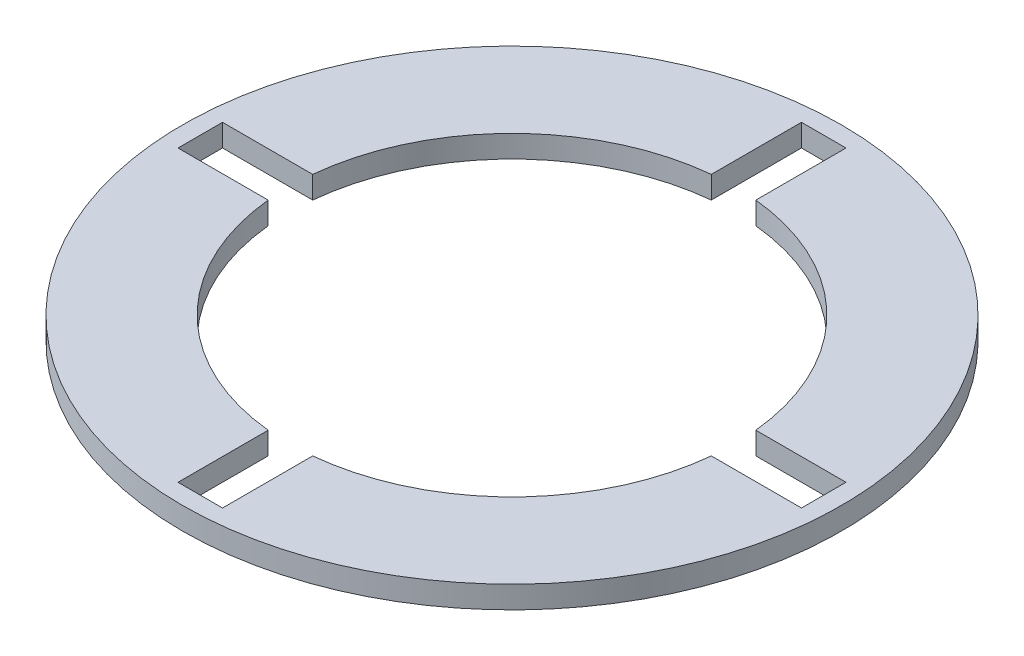
ISO-10303-21;
HEADER;
FILE_DESCRIPTION(('STEP AP214'),'2;1');
FILE_NAME('part.step','',(''),(''),'','','');
FILE_SCHEMA(('AUTOMOTIVE_DESIGN { 1 0 10303 214 1 1 1 1 }'));
ENDSEC;
DATA;
#1=APPLICATION_CONTEXT('core data for automotive mechanical design processes');
#2=APPLICATION_PROTOCOL_DEFINITION('international standard','automotive_design',2000,#1);
#3=PRODUCT_CONTEXT('',#1,'mechanical');
#4=PRODUCT('Part','Part','',(#3));
#5=PRODUCT_RELATED_PRODUCT_CATEGORY('part','',(#4));
#6=PRODUCT_DEFINITION_FORMATION('','',#4);
#7=PRODUCT_DEFINITION_CONTEXT('part definition',#1,'design');
#8=PRODUCT_DEFINITION('design','',#6,#7);
#9=PRODUCT_DEFINITION_SHAPE('','',#8);
#10=(LENGTH_UNIT() NAMED_UNIT(*) SI_UNIT(.MILLI.,.METRE.));
#11=(NAMED_UNIT(*) PLANE_ANGLE_UNIT() SI_UNIT($,.RADIAN.));
#12=(NAMED_UNIT(*) SI_UNIT($,.STERADIAN.) SOLID_ANGLE_UNIT());
#13=UNCERTAINTY_MEASURE_WITH_UNIT(LENGTH_MEASURE(1.E-05),#10,'distance_accuracy_value','');
#14=(GEOMETRIC_REPRESENTATION_CONTEXT(3) GLOBAL_UNCERTAINTY_ASSIGNED_CONTEXT((#13)) GLOBAL_UNIT_ASSIGNED_CONTEXT((#10,
#11,#12)) REPRESENTATION_CONTEXT('',''));
#15=CARTESIAN_POINT('',(0.,0.,0.));
#16=DIRECTION('',(0.,0.,1.));
#17=DIRECTION('',(1.,0.,0.));
#18=AXIS2_PLACEMENT_3D('',#15,#16,#17);
#19=CARTESIAN_POINT('',(0.,3.175,0.));
#20=DIRECTION('',(0.,1.,0.));
#21=DIRECTION('',(0.,0.,1.));
#22=AXIS2_PLACEMENT_3D('',#19,#20,#21);
#23=PLANE('',#22);
#24=CARTESIAN_POINT('',(0.,3.175,0.));
#25=DIRECTION('',(0.,1.,0.));
#26=DIRECTION('',(0.,0.,1.));
#27=AXIS2_PLACEMENT_3D('',#24,#25,#26);
#28=CIRCLE('',#27,31.75);
#29=CARTESIAN_POINT('',(3.175,3.175,31.5908511281352));
#30=VERTEX_POINT('',#29);
#31=CARTESIAN_POINT('',(31.5908511281352,3.175,3.175));
#32=VERTEX_POINT('',#31);
#33=EDGE_CURVE('E147',#30,#32,#28,.T.);
#34=ORIENTED_EDGE('',*,*,#33,.F.);
#35=DIRECTION('',(0.,0.,1.));
#36=VECTOR('',#35,1.);
#37=CARTESIAN_POINT('',(3.175,3.175,0.));
#38=LINE('',#37,#36);
#39=CARTESIAN_POINT('',(3.175,3.175,44.45));
#40=VERTEX_POINT('',#39);
#41=EDGE_CURVE('E160',#30,#40,#38,.T.);
#42=ORIENTED_EDGE('',*,*,#41,.T.);
#43=DIRECTION('',(-1.,0.,0.));
#44=VECTOR('',#43,1.);
#45=CARTESIAN_POINT('',(0.,3.175,44.45));
#46=LINE('',#45,#44);
#47=CARTESIAN_POINT('',(-3.17499999999999,3.175,44.45));
#48=VERTEX_POINT('',#47);
#49=EDGE_CURVE('E173',#40,#48,#46,.T.);
#50=ORIENTED_EDGE('',*,*,#49,.T.);
#51=DIRECTION('',(0.,0.,1.));
#52=VECTOR('',#51,1.);
#53=CARTESIAN_POINT('',(-3.175,3.175,0.));
#54=LINE('',#53,#52);
#55=CARTESIAN_POINT('',(-3.175,3.175,31.5908511281352));
#56=VERTEX_POINT('',#55);
#57=EDGE_CURVE('E177',#56,#48,#54,.T.);
#58=ORIENTED_EDGE('',*,*,#57,.F.);
#59=CARTESIAN_POINT('',(-31.5908511281352,3.175,3.175));
#60=VERTEX_POINT('',#59);
#61=EDGE_CURVE('E167',#60,#56,#28,.T.);
#62=ORIENTED_EDGE('',*,*,#61,.F.);
#63=DIRECTION('',(1.,0.,0.));
#64=VECTOR('',#63,1.);
#65=CARTESIAN_POINT('',(0.,3.175,3.175));
#66=LINE('',#65,#64);
#67=CARTESIAN_POINT('',(-44.45,3.175,3.175));
#68=VERTEX_POINT('',#67);
#69=EDGE_CURVE('E247',#68,#60,#66,.T.);
#70=ORIENTED_EDGE('',*,*,#69,.F.);
#71=DIRECTION('',(0.,0.,1.));
#72=VECTOR('',#71,1.);
#73=CARTESIAN_POINT('',(-44.45,3.175,0.));
#74=LINE('',#73,#72);
#75=CARTESIAN_POINT('',(-44.45,3.175,-3.175));
#76=VERTEX_POINT('',#75);
#77=EDGE_CURVE('E244',#76,#68,#74,.T.);
#78=ORIENTED_EDGE('',*,*,#77,.F.);
#79=DIRECTION('',(1.,0.,0.));
#80=VECTOR('',#79,1.);
#81=CARTESIAN_POINT('',(0.,3.175,-3.175));
#82=LINE('',#81,#80);
#83=CARTESIAN_POINT('',(-31.5908511281352,3.175,-3.175));
#84=VERTEX_POINT('',#83);
#85=EDGE_CURVE('E250',#76,#84,#82,.T.);
#86=ORIENTED_EDGE('',*,*,#85,.T.);
#87=CARTESIAN_POINT('',(-3.17500000000001,3.175,-31.5908511281352));
#88=VERTEX_POINT('',#87);
#89=EDGE_CURVE('E48',#88,#84,#28,.T.);
#90=ORIENTED_EDGE('',*,*,#89,.F.);
#91=DIRECTION('',(0.,0.,1.));
#92=VECTOR('',#91,1.);
#93=CARTESIAN_POINT('',(-3.175,3.175,0.));
#94=LINE('',#93,#92);
#95=CARTESIAN_POINT('',(-3.17500000000001,3.175,-44.45));
#96=VERTEX_POINT('',#95);
#97=EDGE_CURVE('E189',#96,#88,#94,.T.);
#98=ORIENTED_EDGE('',*,*,#97,.F.);
#99=DIRECTION('',(-1.,0.,0.));
#100=VECTOR('',#99,1.);
#101=CARTESIAN_POINT('',(0.,3.175,-44.45));
#102=LINE('',#101,#100);
#103=CARTESIAN_POINT('',(3.17499999999999,3.175,-44.45));
#104=VERTEX_POINT('',#103);
#105=EDGE_CURVE('E186',#104,#96,#102,.T.);
#106=ORIENTED_EDGE('',*,*,#105,.F.);
#107=DIRECTION('',(0.,0.,1.));
#108=VECTOR('',#107,1.);
#109=CARTESIAN_POINT('',(3.175,3.175,0.));
#110=LINE('',#109,#108);
#111=CARTESIAN_POINT('',(3.17499999999999,3.175,-31.5908511281352));
#112=VERTEX_POINT('',#111);
#113=EDGE_CURVE('E192',#104,#112,#110,.T.);
#114=ORIENTED_EDGE('',*,*,#113,.T.);
#115=CARTESIAN_POINT('',(31.5908511281352,3.175,-3.175));
#116=VERTEX_POINT('',#115);
#117=EDGE_CURVE('E165',#116,#112,#28,.T.);
#118=ORIENTED_EDGE('',*,*,#117,.F.);
#119=DIRECTION('',(1.,0.,0.));
#120=VECTOR('',#119,1.);
#121=CARTESIAN_POINT('',(0.,3.175,-3.175));
#122=LINE('',#121,#120);
#123=CARTESIAN_POINT('',(44.45,3.175,-3.175));
#124=VERTEX_POINT('',#123);
#125=EDGE_CURVE('E295',#116,#124,#122,.T.);
#126=ORIENTED_EDGE('',*,*,#125,.T.);
#127=DIRECTION('',(0.,0.,1.));
#128=VECTOR('',#127,1.);
#129=CARTESIAN_POINT('',(44.45,3.175,0.));
#130=LINE('',#129,#128);
#131=CARTESIAN_POINT('',(44.45,3.175,3.175));
#132=VERTEX_POINT('',#131);
#133=EDGE_CURVE('E285',#124,#132,#130,.T.);
#134=ORIENTED_EDGE('',*,*,#133,.T.);
#135=DIRECTION('',(1.,0.,0.));
#136=VECTOR('',#135,1.);
#137=CARTESIAN_POINT('',(0.,3.175,3.175));
#138=LINE('',#137,#136);
#139=EDGE_CURVE('E163',#32,#132,#138,.T.);
#140=ORIENTED_EDGE('',*,*,#139,.F.);
#141=EDGE_LOOP('',(#34,#42,#50,#58,#62,#70,#78,#86,#90,#98,#106,#114,#118,#126,#134,#140));
#142=FACE_BOUND('',#141,.T.);
#143=CARTESIAN_POINT('',(0.,3.175,0.));
#144=DIRECTION('',(0.,1.,0.));
#145=DIRECTION('',(0.,0.,1.));
#146=AXIS2_PLACEMENT_3D('',#143,#144,#145);
#147=CIRCLE('',#146,46.99);
#148=CARTESIAN_POINT('',(0.,3.175,46.99));
#149=VERTEX_POINT('',#148);
#150=EDGE_CURVE('E206',#149,#149,#147,.T.);
#151=ORIENTED_EDGE('',*,*,#150,.T.);
#152=EDGE_LOOP('',(#151));
#153=FACE_BOUND('',#152,.T.);
#154=ADVANCED_FACE('F33',(#142,#153),#23,.T.);
#155=CARTESIAN_POINT('',(0.,0.,0.));
#156=DIRECTION('',(0.,1.,0.));
#157=DIRECTION('',(0.,0.,1.));
#158=AXIS2_PLACEMENT_3D('',#155,#156,#157);
#159=PLANE('',#158);
#160=CARTESIAN_POINT('',(0.,0.,0.));
#161=DIRECTION('',(0.,1.,0.));
#162=DIRECTION('',(0.,0.,1.));
#163=AXIS2_PLACEMENT_3D('',#160,#161,#162);
#164=CIRCLE('',#163,46.99);
#165=CARTESIAN_POINT('',(0.,0.,46.99));
#166=VERTEX_POINT('',#165);
#167=EDGE_CURVE('E205',#166,#166,#164,.T.);
#168=ORIENTED_EDGE('',*,*,#167,.F.);
#169=EDGE_LOOP('',(#168));
#170=FACE_BOUND('',#169,.T.);
#171=DIRECTION('',(0.,0.,1.));
#172=VECTOR('',#171,1.);
#173=CARTESIAN_POINT('',(3.175,0.,0.));
#174=LINE('',#173,#172);
#175=CARTESIAN_POINT('',(3.175,0.,31.5908511281352));
#176=VERTEX_POINT('',#175);
#177=CARTESIAN_POINT('',(3.175,0.,44.45));
#178=VERTEX_POINT('',#177);
#179=EDGE_CURVE('E184',#176,#178,#174,.T.);
#180=ORIENTED_EDGE('',*,*,#179,.F.);
#181=CARTESIAN_POINT('',(0.,0.,0.));
#182=DIRECTION('',(0.,1.,0.));
#183=DIRECTION('',(0.,0.,1.));
#184=AXIS2_PLACEMENT_3D('',#181,#182,#183);
#185=CIRCLE('',#184,31.75);
#186=CARTESIAN_POINT('',(31.5908511281352,0.,3.175));
#187=VERTEX_POINT('',#186);
#188=EDGE_CURVE('E150',#176,#187,#185,.T.);
#189=ORIENTED_EDGE('',*,*,#188,.T.);
#190=DIRECTION('',(1.,0.,0.));
#191=VECTOR('',#190,1.);
#192=CARTESIAN_POINT('',(0.,0.,3.175));
#193=LINE('',#192,#191);
#194=CARTESIAN_POINT('',(44.45,0.,3.175));
#195=VERTEX_POINT('',#194);
#196=EDGE_CURVE('E235',#187,#195,#193,.T.);
#197=ORIENTED_EDGE('',*,*,#196,.T.);
#198=DIRECTION('',(0.,0.,1.));
#199=VECTOR('',#198,1.);
#200=CARTESIAN_POINT('',(44.45,0.,0.));
#201=LINE('',#200,#199);
#202=CARTESIAN_POINT('',(44.45,0.,-3.175));
#203=VERTEX_POINT('',#202);
#204=EDGE_CURVE('E41',#203,#195,#201,.T.);
#205=ORIENTED_EDGE('',*,*,#204,.F.);
#206=DIRECTION('',(1.,0.,0.));
#207=VECTOR('',#206,1.);
#208=CARTESIAN_POINT('',(0.,0.,-3.175));
#209=LINE('',#208,#207);
#210=CARTESIAN_POINT('',(31.5908511281352,0.,-3.175));
#211=VERTEX_POINT('',#210);
#212=EDGE_CURVE('E236',#211,#203,#209,.T.);
#213=ORIENTED_EDGE('',*,*,#212,.F.);
#214=CARTESIAN_POINT('',(3.17499999999999,0.,-31.5908511281352));
#215=VERTEX_POINT('',#214);
#216=EDGE_CURVE('E164',#211,#215,#185,.T.);
#217=ORIENTED_EDGE('',*,*,#216,.T.);
#218=DIRECTION('',(0.,0.,1.));
#219=VECTOR('',#218,1.);
#220=CARTESIAN_POINT('',(3.175,0.,0.));
#221=LINE('',#220,#219);
#222=CARTESIAN_POINT('',(3.17499999999999,0.,-44.45));
#223=VERTEX_POINT('',#222);
#224=EDGE_CURVE('E202',#223,#215,#221,.T.);
#225=ORIENTED_EDGE('',*,*,#224,.F.);
#226=DIRECTION('',(-1.,0.,0.));
#227=VECTOR('',#226,1.);
#228=CARTESIAN_POINT('',(0.,0.,-44.45));
#229=LINE('',#228,#227);
#230=CARTESIAN_POINT('',(-3.17500000000001,0.,-44.45));
#231=VERTEX_POINT('',#230);
#232=EDGE_CURVE('E209',#223,#231,#229,.T.);
#233=ORIENTED_EDGE('',*,*,#232,.T.);
#234=DIRECTION('',(0.,0.,1.));
#235=VECTOR('',#234,1.);
#236=CARTESIAN_POINT('',(-3.175,0.,0.));
#237=LINE('',#236,#235);
#238=CARTESIAN_POINT('',(-3.17500000000001,0.,-31.5908511281352));
#239=VERTEX_POINT('',#238);
#240=EDGE_CURVE('E198',#231,#239,#237,.T.);
#241=ORIENTED_EDGE('',*,*,#240,.T.);
#242=CARTESIAN_POINT('',(-31.5908511281352,0.,-3.175));
#243=VERTEX_POINT('',#242);
#244=EDGE_CURVE('E275',#239,#243,#185,.T.);
#245=ORIENTED_EDGE('',*,*,#244,.T.);
#246=DIRECTION('',(1.,0.,0.));
#247=VECTOR('',#246,1.);
#248=CARTESIAN_POINT('',(0.,0.,-3.175));
#249=LINE('',#248,#247);
#250=CARTESIAN_POINT('',(-44.45,0.,-3.175));
#251=VERTEX_POINT('',#250);
#252=EDGE_CURVE('E260',#251,#243,#249,.T.);
#253=ORIENTED_EDGE('',*,*,#252,.F.);
#254=DIRECTION('',(0.,0.,1.));
#255=VECTOR('',#254,1.);
#256=CARTESIAN_POINT('',(-44.45,0.,0.));
#257=LINE('',#256,#255);
#258=CARTESIAN_POINT('',(-44.45,0.,3.175));
#259=VERTEX_POINT('',#258);
#260=EDGE_CURVE('E217',#251,#259,#257,.T.);
#261=ORIENTED_EDGE('',*,*,#260,.T.);
#262=DIRECTION('',(1.,0.,0.));
#263=VECTOR('',#262,1.);
#264=CARTESIAN_POINT('',(0.,0.,3.175));
#265=LINE('',#264,#263);
#266=CARTESIAN_POINT('',(-31.5908511281352,0.,3.175));
#267=VERTEX_POINT('',#266);
#268=EDGE_CURVE('E256',#259,#267,#265,.T.);
#269=ORIENTED_EDGE('',*,*,#268,.T.);
#270=CARTESIAN_POINT('',(-3.175,0.,31.5908511281352));
#271=VERTEX_POINT('',#270);
#272=EDGE_CURVE('E56',#267,#271,#185,.T.);
#273=ORIENTED_EDGE('',*,*,#272,.T.);
#274=DIRECTION('',(0.,0.,1.));
#275=VECTOR('',#274,1.);
#276=CARTESIAN_POINT('',(-3.175,0.,0.));
#277=LINE('',#276,#275);
#278=CARTESIAN_POINT('',(-3.17499999999999,0.,44.45));
#279=VERTEX_POINT('',#278);
#280=EDGE_CURVE('E181',#271,#279,#277,.T.);
#281=ORIENTED_EDGE('',*,*,#280,.T.);
#282=DIRECTION('',(-1.,0.,0.));
#283=VECTOR('',#282,1.);
#284=CARTESIAN_POINT('',(0.,0.,44.45));
#285=LINE('',#284,#283);
#286=EDGE_CURVE('E214',#178,#279,#285,.T.);
#287=ORIENTED_EDGE('',*,*,#286,.F.);
#288=EDGE_LOOP('',(#180,#189,#197,#205,#213,#217,#225,#233,#241,#245,#253,#261,#269,#273,#281,#287));
#289=FACE_BOUND('',#288,.T.);
#290=ADVANCED_FACE('F273',(#170,#289),#159,.F.);
#291=CARTESIAN_POINT('',(0.,3.175,0.));
#292=DIRECTION('',(0.,-1.,0.));
#293=DIRECTION('',(0.,0.,-1.));
#294=AXIS2_PLACEMENT_3D('',#291,#292,#293);
#295=CYLINDRICAL_SURFACE('',#294,46.99);
#296=ORIENTED_EDGE('',*,*,#150,.F.);
#297=EDGE_LOOP('',(#296));
#298=FACE_BOUND('',#297,.T.);
#299=ORIENTED_EDGE('',*,*,#167,.T.);
#300=EDGE_LOOP('',(#299));
#301=FACE_BOUND('',#300,.T.);
#302=ADVANCED_FACE('F35',(#298,#301),#295,.T.);
#303=CARTESIAN_POINT('',(0.,-4.445,-44.45));
#304=DIRECTION('',(0.,0.,-1.));
#305=DIRECTION('',(-1.,0.,0.));
#306=AXIS2_PLACEMENT_3D('',#303,#304,#305);
#307=PLANE('',#306);
#308=DIRECTION('',(0.,1.,0.));
#309=VECTOR('',#308,1.);
#310=CARTESIAN_POINT('',(3.17499999999999,-4.445,-44.45));
#311=LINE('',#310,#309);
#312=EDGE_CURVE('E196',#223,#104,#311,.T.);
#313=ORIENTED_EDGE('',*,*,#312,.T.);
#314=ORIENTED_EDGE('',*,*,#105,.T.);
#315=DIRECTION('',(0.,1.,0.));
#316=VECTOR('',#315,1.);
#317=CARTESIAN_POINT('',(-3.17500000000001,-4.445,-44.45));
#318=LINE('',#317,#316);
#319=EDGE_CURVE('E195',#231,#96,#318,.T.);
#320=ORIENTED_EDGE('',*,*,#319,.F.);
#321=ORIENTED_EDGE('',*,*,#232,.F.);
#322=EDGE_LOOP('',(#313,#314,#320,#321));
#323=FACE_BOUND('',#322,.T.);
#324=ADVANCED_FACE('F310',(#323),#307,.F.);
#325=CARTESIAN_POINT('',(3.175,-4.445,0.));
#326=DIRECTION('',(-1.,0.,0.));
#327=DIRECTION('',(0.,0.,1.));
#328=AXIS2_PLACEMENT_3D('',#325,#326,#327);
#329=PLANE('',#328);
#330=DIRECTION('',(0.,1.,0.));
#331=VECTOR('',#330,1.);
#332=CARTESIAN_POINT('',(3.17499999999999,-1.905,-31.5908511281352));
#333=LINE('',#332,#331);
#334=EDGE_CURVE('E289',#112,#215,#333,.F.);
#335=ORIENTED_EDGE('',*,*,#334,.F.);
#336=ORIENTED_EDGE('',*,*,#113,.F.);
#337=ORIENTED_EDGE('',*,*,#312,.F.);
#338=ORIENTED_EDGE('',*,*,#224,.T.);
#339=EDGE_LOOP('',(#335,#336,#337,#338));
#340=FACE_BOUND('',#339,.T.);
#341=ADVANCED_FACE('F304',(#340),#329,.T.);
#342=CARTESIAN_POINT('',(-3.175,-4.445,0.));
#343=DIRECTION('',(-1.,0.,0.));
#344=DIRECTION('',(0.,0.,1.));
#345=AXIS2_PLACEMENT_3D('',#342,#343,#344);
#346=PLANE('',#345);
#347=ORIENTED_EDGE('',*,*,#97,.T.);
#348=DIRECTION('',(0.,1.,0.));
#349=VECTOR('',#348,1.);
#350=CARTESIAN_POINT('',(-3.17500000000001,-1.905,-31.5908511281352));
#351=LINE('',#350,#349);
#352=EDGE_CURVE('E282',#88,#239,#351,.F.);
#353=ORIENTED_EDGE('',*,*,#352,.T.);
#354=ORIENTED_EDGE('',*,*,#240,.F.);
#355=ORIENTED_EDGE('',*,*,#319,.T.);
#356=EDGE_LOOP('',(#347,#353,#354,#355));
#357=FACE_BOUND('',#356,.T.);
#358=ADVANCED_FACE('F312',(#357),#346,.F.);
#359=CARTESIAN_POINT('',(0.,-4.445,44.45));
#360=DIRECTION('',(0.,0.,-1.));
#361=DIRECTION('',(-1.,0.,0.));
#362=AXIS2_PLACEMENT_3D('',#359,#360,#361);
#363=PLANE('',#362);
#364=ORIENTED_EDGE('',*,*,#286,.T.);
#365=DIRECTION('',(0.,1.,0.));
#366=VECTOR('',#365,1.);
#367=CARTESIAN_POINT('',(-3.17499999999999,-4.445,44.45));
#368=LINE('',#367,#366);
#369=EDGE_CURVE('E172',#279,#48,#368,.T.);
#370=ORIENTED_EDGE('',*,*,#369,.T.);
#371=ORIENTED_EDGE('',*,*,#49,.F.);
#372=DIRECTION('',(0.,1.,0.));
#373=VECTOR('',#372,1.);
#374=CARTESIAN_POINT('',(3.175,-4.445,44.45));
#375=LINE('',#374,#373);
#376=EDGE_CURVE('E170',#178,#40,#375,.T.);
#377=ORIENTED_EDGE('',*,*,#376,.F.);
#378=EDGE_LOOP('',(#364,#370,#371,#377));
#379=FACE_BOUND('',#378,.T.);
#380=ADVANCED_FACE('F271',(#379),#363,.T.);
#381=CARTESIAN_POINT('',(3.175,-4.445,0.));
#382=DIRECTION('',(-1.,0.,0.));
#383=DIRECTION('',(0.,0.,1.));
#384=AXIS2_PLACEMENT_3D('',#381,#382,#383);
#385=PLANE('',#384);
#386=DIRECTION('',(0.,1.,0.));
#387=VECTOR('',#386,1.);
#388=CARTESIAN_POINT('',(3.175,-1.905,31.5908511281352));
#389=LINE('',#388,#387);
#390=EDGE_CURVE('E144',#176,#30,#389,.T.);
#391=ORIENTED_EDGE('',*,*,#390,.F.);
#392=ORIENTED_EDGE('',*,*,#179,.T.);
#393=ORIENTED_EDGE('',*,*,#376,.T.);
#394=ORIENTED_EDGE('',*,*,#41,.F.);
#395=EDGE_LOOP('',(#391,#392,#393,#394));
#396=FACE_BOUND('',#395,.T.);
#397=ADVANCED_FACE('F168',(#396),#385,.T.);
#398=CARTESIAN_POINT('',(-3.175,-4.445,0.));
#399=DIRECTION('',(-1.,0.,0.));
#400=DIRECTION('',(0.,0.,1.));
#401=AXIS2_PLACEMENT_3D('',#398,#399,#400);
#402=PLANE('',#401);
#403=ORIENTED_EDGE('',*,*,#280,.F.);
#404=DIRECTION('',(0.,1.,0.));
#405=VECTOR('',#404,1.);
#406=CARTESIAN_POINT('',(-3.175,-1.905,31.5908511281352));
#407=LINE('',#406,#405);
#408=EDGE_CURVE('E268',#271,#56,#407,.T.);
#409=ORIENTED_EDGE('',*,*,#408,.T.);
#410=ORIENTED_EDGE('',*,*,#57,.T.);
#411=ORIENTED_EDGE('',*,*,#369,.F.);
#412=EDGE_LOOP('',(#403,#409,#410,#411));
#413=FACE_BOUND('',#412,.T.);
#414=ADVANCED_FACE('F267',(#413),#402,.F.);
#415=CARTESIAN_POINT('',(-44.45,-4.445,0.));
#416=DIRECTION('',(-1.,0.,0.));
#417=DIRECTION('',(0.,0.,1.));
#418=AXIS2_PLACEMENT_3D('',#415,#416,#417);
#419=PLANE('',#418);
#420=DIRECTION('',(0.,1.,0.));
#421=VECTOR('',#420,1.);
#422=CARTESIAN_POINT('',(-44.45,-4.445,-3.175));
#423=LINE('',#422,#421);
#424=EDGE_CURVE('E254',#251,#76,#423,.T.);
#425=ORIENTED_EDGE('',*,*,#424,.T.);
#426=ORIENTED_EDGE('',*,*,#77,.T.);
#427=DIRECTION('',(0.,1.,0.));
#428=VECTOR('',#427,1.);
#429=CARTESIAN_POINT('',(-44.45,-4.445,3.175));
#430=LINE('',#429,#428);
#431=EDGE_CURVE('E253',#259,#68,#430,.T.);
#432=ORIENTED_EDGE('',*,*,#431,.F.);
#433=ORIENTED_EDGE('',*,*,#260,.F.);
#434=EDGE_LOOP('',(#425,#426,#432,#433));
#435=FACE_BOUND('',#434,.T.);
#436=ADVANCED_FACE('F322',(#435),#419,.F.);
#437=CARTESIAN_POINT('',(0.,-4.445,-3.175));
#438=DIRECTION('',(0.,0.,1.));
#439=DIRECTION('',(1.,0.,0.));
#440=AXIS2_PLACEMENT_3D('',#437,#438,#439);
#441=PLANE('',#440);
#442=DIRECTION('',(0.,1.,0.));
#443=VECTOR('',#442,1.);
#444=CARTESIAN_POINT('',(-31.5908511281352,-1.905,-3.175));
#445=LINE('',#444,#443);
#446=EDGE_CURVE('E276',#84,#243,#445,.F.);
#447=ORIENTED_EDGE('',*,*,#446,.F.);
#448=ORIENTED_EDGE('',*,*,#85,.F.);
#449=ORIENTED_EDGE('',*,*,#424,.F.);
#450=ORIENTED_EDGE('',*,*,#252,.T.);
#451=EDGE_LOOP('',(#447,#448,#449,#450));
#452=FACE_BOUND('',#451,.T.);
#453=ADVANCED_FACE('F325',(#452),#441,.T.);
#454=CARTESIAN_POINT('',(0.,-4.445,3.175));
#455=DIRECTION('',(0.,0.,1.));
#456=DIRECTION('',(1.,0.,0.));
#457=AXIS2_PLACEMENT_3D('',#454,#455,#456);
#458=PLANE('',#457);
#459=ORIENTED_EDGE('',*,*,#69,.T.);
#460=DIRECTION('',(0.,1.,0.));
#461=VECTOR('',#460,1.);
#462=CARTESIAN_POINT('',(-31.5908511281352,-1.905,3.175));
#463=LINE('',#462,#461);
#464=EDGE_CURVE('E154',#60,#267,#463,.F.);
#465=ORIENTED_EDGE('',*,*,#464,.T.);
#466=ORIENTED_EDGE('',*,*,#268,.F.);
#467=ORIENTED_EDGE('',*,*,#431,.T.);
#468=EDGE_LOOP('',(#459,#465,#466,#467));
#469=FACE_BOUND('',#468,.T.);
#470=ADVANCED_FACE('F319',(#469),#458,.F.);
#471=CARTESIAN_POINT('',(44.45,-4.445,0.));
#472=DIRECTION('',(-1.,0.,0.));
#473=DIRECTION('',(0.,0.,1.));
#474=AXIS2_PLACEMENT_3D('',#471,#472,#473);
#475=PLANE('',#474);
#476=ORIENTED_EDGE('',*,*,#204,.T.);
#477=DIRECTION('',(0.,1.,0.));
#478=VECTOR('',#477,1.);
#479=CARTESIAN_POINT('',(44.45,-4.445,3.175));
#480=LINE('',#479,#478);
#481=EDGE_CURVE('E227',#195,#132,#480,.T.);
#482=ORIENTED_EDGE('',*,*,#481,.T.);
#483=ORIENTED_EDGE('',*,*,#133,.F.);
#484=DIRECTION('',(0.,1.,0.));
#485=VECTOR('',#484,1.);
#486=CARTESIAN_POINT('',(44.45,-4.445,-3.175));
#487=LINE('',#486,#485);
#488=EDGE_CURVE('E229',#203,#124,#487,.T.);
#489=ORIENTED_EDGE('',*,*,#488,.F.);
#490=EDGE_LOOP('',(#476,#482,#483,#489));
#491=FACE_BOUND('',#490,.T.);
#492=ADVANCED_FACE('F225',(#491),#475,.T.);
#493=CARTESIAN_POINT('',(0.,-4.445,3.175));
#494=DIRECTION('',(0.,0.,1.));
#495=DIRECTION('',(1.,0.,0.));
#496=AXIS2_PLACEMENT_3D('',#493,#494,#495);
#497=PLANE('',#496);
#498=ORIENTED_EDGE('',*,*,#196,.F.);
#499=DIRECTION('',(0.,1.,0.));
#500=VECTOR('',#499,1.);
#501=CARTESIAN_POINT('',(31.5908511281352,-1.905,3.175));
#502=LINE('',#501,#500);
#503=EDGE_CURVE('E280',#187,#32,#502,.T.);
#504=ORIENTED_EDGE('',*,*,#503,.T.);
#505=ORIENTED_EDGE('',*,*,#139,.T.);
#506=ORIENTED_EDGE('',*,*,#481,.F.);
#507=EDGE_LOOP('',(#498,#504,#505,#506));
#508=FACE_BOUND('',#507,.T.);
#509=ADVANCED_FACE('F234',(#508),#497,.F.);
#510=CARTESIAN_POINT('',(0.,-4.445,-3.175));
#511=DIRECTION('',(0.,0.,1.));
#512=DIRECTION('',(1.,0.,0.));
#513=AXIS2_PLACEMENT_3D('',#510,#511,#512);
#514=PLANE('',#513);
#515=DIRECTION('',(0.,1.,0.));
#516=VECTOR('',#515,1.);
#517=CARTESIAN_POINT('',(31.5908511281352,-1.905,-3.175));
#518=LINE('',#517,#516);
#519=EDGE_CURVE('E11',#211,#116,#518,.T.);
#520=ORIENTED_EDGE('',*,*,#519,.F.);
#521=ORIENTED_EDGE('',*,*,#212,.T.);
#522=ORIENTED_EDGE('',*,*,#488,.T.);
#523=ORIENTED_EDGE('',*,*,#125,.F.);
#524=EDGE_LOOP('',(#520,#521,#522,#523));
#525=FACE_BOUND('',#524,.T.);
#526=ADVANCED_FACE('F300',(#525),#514,.T.);
#527=CARTESIAN_POINT('',(0.,-1.905,0.));
#528=DIRECTION('',(0.,1.,0.));
#529=DIRECTION('',(0.,0.,1.));
#530=AXIS2_PLACEMENT_3D('',#527,#528,#529);
#531=CYLINDRICAL_SURFACE('',#530,31.75);
#532=ORIENTED_EDGE('',*,*,#334,.T.);
#533=ORIENTED_EDGE('',*,*,#216,.F.);
#534=ORIENTED_EDGE('',*,*,#519,.T.);
#535=ORIENTED_EDGE('',*,*,#117,.T.);
#536=EDGE_LOOP('',(#532,#533,#534,#535));
#537=FACE_BOUND('',#536,.T.);
#538=ADVANCED_FACE('F301',(#537),#531,.F.);
#539=ORIENTED_EDGE('',*,*,#390,.T.);
#540=ORIENTED_EDGE('',*,*,#33,.T.);
#541=ORIENTED_EDGE('',*,*,#503,.F.);
#542=ORIENTED_EDGE('',*,*,#188,.F.);
#543=EDGE_LOOP('',(#539,#540,#541,#542));
#544=FACE_BOUND('',#543,.T.);
#545=ADVANCED_FACE('F146',(#544),#531,.F.);
#546=ORIENTED_EDGE('',*,*,#272,.F.);
#547=ORIENTED_EDGE('',*,*,#464,.F.);
#548=ORIENTED_EDGE('',*,*,#61,.T.);
#549=ORIENTED_EDGE('',*,*,#408,.F.);
#550=EDGE_LOOP('',(#546,#547,#548,#549));
#551=FACE_BOUND('',#550,.T.);
#552=ADVANCED_FACE('F316',(#551),#531,.F.);
#553=ORIENTED_EDGE('',*,*,#89,.T.);
#554=ORIENTED_EDGE('',*,*,#446,.T.);
#555=ORIENTED_EDGE('',*,*,#244,.F.);
#556=ORIENTED_EDGE('',*,*,#352,.F.);
#557=EDGE_LOOP('',(#553,#554,#555,#556));
#558=FACE_BOUND('',#557,.T.);
#559=ADVANCED_FACE('F313',(#558),#531,.F.);
#560=CLOSED_SHELL('',(#154,#290,#302,#324,#341,#358,#380,#397,#414,#436,#453,#470,#492,#509,
#526,#538,#545,#552,#559));
#561=MANIFOLD_SOLID_BREP('B2',#560);
#562=ADVANCED_BREP_SHAPE_REPRESENTATION('',(#18,#561),#14);
#563=SHAPE_DEFINITION_REPRESENTATION(#9,#562);
ENDSEC;
END-ISO-10303-21;
